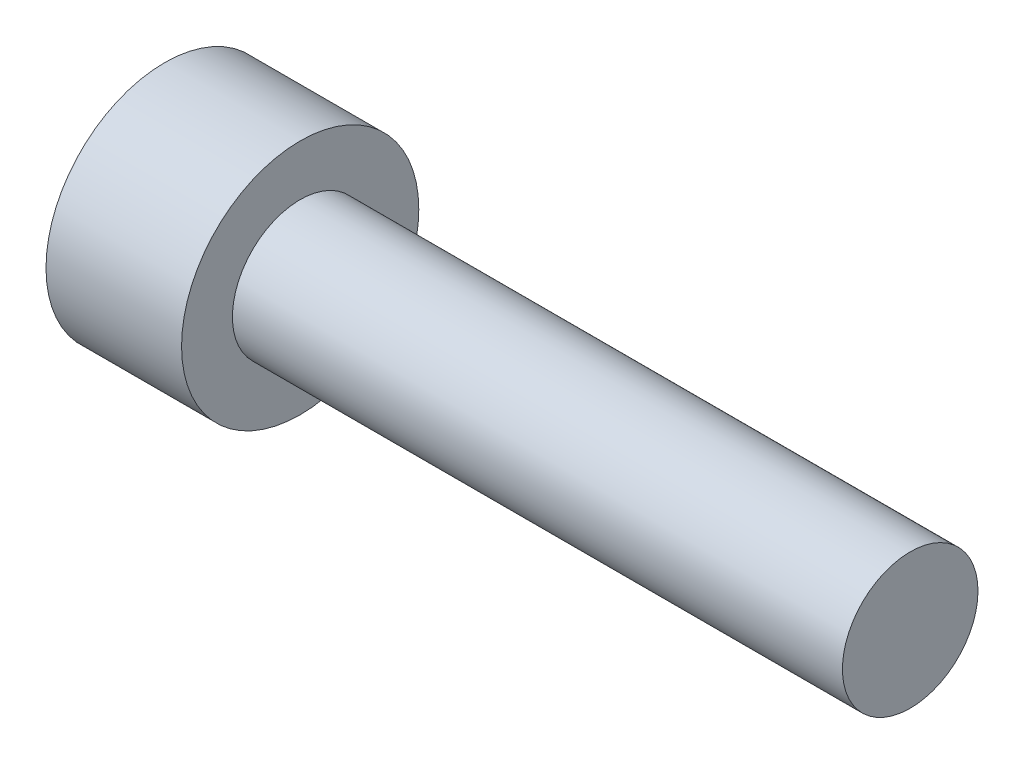
ISO-10303-21;
HEADER;
FILE_DESCRIPTION(('STEP AP214'),'2;1');
FILE_NAME('part.step','',(''),(''),'','','');
FILE_SCHEMA(('AUTOMOTIVE_DESIGN { 1 0 10303 214 1 1 1 1 }'));
ENDSEC;
DATA;
#1=APPLICATION_CONTEXT('core data for automotive mechanical design processes');
#2=APPLICATION_PROTOCOL_DEFINITION('international standard','automotive_design',2000,#1);
#3=PRODUCT_CONTEXT('',#1,'mechanical');
#4=PRODUCT('Part','Part','',(#3));
#5=PRODUCT_RELATED_PRODUCT_CATEGORY('part','',(#4));
#6=PRODUCT_DEFINITION_FORMATION('','',#4);
#7=PRODUCT_DEFINITION_CONTEXT('part definition',#1,'design');
#8=PRODUCT_DEFINITION('design','',#6,#7);
#9=PRODUCT_DEFINITION_SHAPE('','',#8);
#10=(LENGTH_UNIT() NAMED_UNIT(*) SI_UNIT(.MILLI.,.METRE.));
#11=(NAMED_UNIT(*) PLANE_ANGLE_UNIT() SI_UNIT($,.RADIAN.));
#12=(NAMED_UNIT(*) SI_UNIT($,.STERADIAN.) SOLID_ANGLE_UNIT());
#13=UNCERTAINTY_MEASURE_WITH_UNIT(LENGTH_MEASURE(1.E-05),#10,'distance_accuracy_value','');
#14=(GEOMETRIC_REPRESENTATION_CONTEXT(3) GLOBAL_UNCERTAINTY_ASSIGNED_CONTEXT((#13)) GLOBAL_UNIT_ASSIGNED_CONTEXT((#10,
#11,#12)) REPRESENTATION_CONTEXT('',''));
#15=CARTESIAN_POINT('',(0.,0.,0.));
#16=DIRECTION('',(0.,0.,1.));
#17=DIRECTION('',(1.,0.,0.));
#18=AXIS2_PLACEMENT_3D('',#15,#16,#17);
#19=CARTESIAN_POINT('',(4.,0.,0.));
#20=DIRECTION('',(-1.,0.,0.));
#21=DIRECTION('',(0.,0.,1.));
#22=AXIS2_PLACEMENT_3D('',#19,#20,#21);
#23=CYLINDRICAL_SURFACE('',#22,3.5);
#24=CARTESIAN_POINT('',(4.,0.,0.));
#25=DIRECTION('',(1.,0.,0.));
#26=DIRECTION('',(0.,0.,-1.));
#27=AXIS2_PLACEMENT_3D('',#24,#25,#26);
#28=CIRCLE('',#27,3.5);
#29=CARTESIAN_POINT('',(4.,0.,-3.5));
#30=VERTEX_POINT('',#29);
#31=EDGE_CURVE('E46',#30,#30,#28,.T.);
#32=ORIENTED_EDGE('',*,*,#31,.F.);
#33=EDGE_LOOP('',(#32));
#34=FACE_BOUND('',#33,.T.);
#35=CARTESIAN_POINT('',(0.,0.,0.));
#36=DIRECTION('',(1.,0.,0.));
#37=DIRECTION('',(0.,0.,-1.));
#38=AXIS2_PLACEMENT_3D('',#35,#36,#37);
#39=CIRCLE('',#38,3.5);
#40=CARTESIAN_POINT('',(0.,0.,-3.5));
#41=VERTEX_POINT('',#40);
#42=EDGE_CURVE('E41',#41,#41,#39,.T.);
#43=ORIENTED_EDGE('',*,*,#42,.T.);
#44=EDGE_LOOP('',(#43));
#45=FACE_BOUND('',#44,.T.);
#46=ADVANCED_FACE('F38',(#34,#45),#23,.T.);
#47=CARTESIAN_POINT('',(4.,0.,0.));
#48=DIRECTION('',(1.,0.,0.));
#49=DIRECTION('',(0.,0.,-1.));
#50=AXIS2_PLACEMENT_3D('',#47,#48,#49);
#51=PLANE('',#50);
#52=CARTESIAN_POINT('',(4.,0.,0.));
#53=DIRECTION('',(1.,0.,0.));
#54=DIRECTION('',(0.,0.,-1.));
#55=AXIS2_PLACEMENT_3D('',#52,#53,#54);
#56=CIRCLE('',#55,2.);
#57=CARTESIAN_POINT('',(4.,0.,-2.));
#58=VERTEX_POINT('',#57);
#59=EDGE_CURVE('E11',#58,#58,#56,.T.);
#60=ORIENTED_EDGE('',*,*,#59,.F.);
#61=EDGE_LOOP('',(#60));
#62=FACE_BOUND('',#61,.T.);
#63=ORIENTED_EDGE('',*,*,#31,.T.);
#64=EDGE_LOOP('',(#63));
#65=FACE_BOUND('',#64,.T.);
#66=ADVANCED_FACE('F156',(#62,#65),#51,.T.);
#67=CARTESIAN_POINT('',(0.,0.,0.));
#68=DIRECTION('',(1.,0.,0.));
#69=DIRECTION('',(0.,0.,-1.));
#70=AXIS2_PLACEMENT_3D('',#67,#68,#69);
#71=PLANE('',#70);
#72=DIRECTION('',(0.,1.,0.));
#73=VECTOR('',#72,1.);
#74=CARTESIAN_POINT('',(0.,-0.880459160514179,1.525));
#75=LINE('',#74,#73);
#76=CARTESIAN_POINT('',(0.,-0.880459160514179,1.525));
#77=VERTEX_POINT('',#76);
#78=CARTESIAN_POINT('',(0.,0.88045916051418,1.525));
#79=VERTEX_POINT('',#78);
#80=EDGE_CURVE('E128',#77,#79,#75,.T.);
#81=ORIENTED_EDGE('',*,*,#80,.F.);
#82=DIRECTION('',(0.,0.5,0.866025403784438));
#83=VECTOR('',#82,1.);
#84=CARTESIAN_POINT('',(0.,-1.76091832102836,0.));
#85=LINE('',#84,#83);
#86=CARTESIAN_POINT('',(0.,-1.76091832102836,0.));
#87=VERTEX_POINT('',#86);
#88=EDGE_CURVE('E54',#87,#77,#85,.T.);
#89=ORIENTED_EDGE('',*,*,#88,.F.);
#90=DIRECTION('',(0.,-0.5,0.866025403784439));
#91=VECTOR('',#90,1.);
#92=CARTESIAN_POINT('',(0.,-0.88045916051418,-1.525));
#93=LINE('',#92,#91);
#94=CARTESIAN_POINT('',(0.,-0.88045916051418,-1.525));
#95=VERTEX_POINT('',#94);
#96=EDGE_CURVE('E138',#95,#87,#93,.T.);
#97=ORIENTED_EDGE('',*,*,#96,.F.);
#98=DIRECTION('',(0.,-1.,0.));
#99=VECTOR('',#98,1.);
#100=CARTESIAN_POINT('',(0.,0.880459160514179,-1.525));
#101=LINE('',#100,#99);
#102=CARTESIAN_POINT('',(0.,0.880459160514179,-1.525));
#103=VERTEX_POINT('',#102);
#104=EDGE_CURVE('E136',#103,#95,#101,.T.);
#105=ORIENTED_EDGE('',*,*,#104,.F.);
#106=DIRECTION('',(0.,-0.5,-0.866025403784439));
#107=VECTOR('',#106,1.);
#108=CARTESIAN_POINT('',(0.,1.76091832102836,0.));
#109=LINE('',#108,#107);
#110=CARTESIAN_POINT('',(0.,1.76091832102836,0.));
#111=VERTEX_POINT('',#110);
#112=EDGE_CURVE('E102',#111,#103,#109,.T.);
#113=ORIENTED_EDGE('',*,*,#112,.F.);
#114=DIRECTION('',(0.,0.5,-0.866025403784439));
#115=VECTOR('',#114,1.);
#116=CARTESIAN_POINT('',(0.,0.88045916051418,1.525));
#117=LINE('',#116,#115);
#118=EDGE_CURVE('E132',#79,#111,#117,.T.);
#119=ORIENTED_EDGE('',*,*,#118,.F.);
#120=EDGE_LOOP('',(#81,#89,#97,#105,#113,#119));
#121=FACE_BOUND('',#120,.T.);
#122=ORIENTED_EDGE('',*,*,#42,.F.);
#123=EDGE_LOOP('',(#122));
#124=FACE_BOUND('',#123,.T.);
#125=ADVANCED_FACE('F153',(#121,#124),#71,.F.);
#126=CARTESIAN_POINT('',(2.,-1.76091832102836,0.));
#127=DIRECTION('',(0.,-0.866025403784439,0.5));
#128=DIRECTION('',(0.,-0.5,-0.866025403784438));
#129=AXIS2_PLACEMENT_3D('',#126,#127,#128);
#130=PLANE('',#129);
#131=ORIENTED_EDGE('',*,*,#88,.T.);
#132=DIRECTION('',(-1.,0.,0.));
#133=VECTOR('',#132,1.);
#134=CARTESIAN_POINT('',(2.,-0.880459160514179,1.525));
#135=LINE('',#134,#133);
#136=CARTESIAN_POINT('',(2.,-0.880459160514179,1.525));
#137=VERTEX_POINT('',#136);
#138=EDGE_CURVE('E84',#137,#77,#135,.T.);
#139=ORIENTED_EDGE('',*,*,#138,.F.);
#140=DIRECTION('',(0.,0.5,0.866025403784438));
#141=VECTOR('',#140,1.);
#142=CARTESIAN_POINT('',(2.,-1.76091832102836,0.));
#143=LINE('',#142,#141);
#144=CARTESIAN_POINT('',(2.,-1.76091832102836,0.));
#145=VERTEX_POINT('',#144);
#146=EDGE_CURVE('E140',#145,#137,#143,.T.);
#147=ORIENTED_EDGE('',*,*,#146,.F.);
#148=DIRECTION('',(-1.,0.,0.));
#149=VECTOR('',#148,1.);
#150=CARTESIAN_POINT('',(2.,-1.76091832102836,0.));
#151=LINE('',#150,#149);
#152=EDGE_CURVE('E62',#145,#87,#151,.T.);
#153=ORIENTED_EDGE('',*,*,#152,.T.);
#154=EDGE_LOOP('',(#131,#139,#147,#153));
#155=FACE_BOUND('',#154,.T.);
#156=ADVANCED_FACE('F155',(#155),#130,.F.);
#157=CARTESIAN_POINT('',(2.,-0.88045916051418,-1.525));
#158=DIRECTION('',(0.,-0.866025403784439,-0.5));
#159=DIRECTION('',(0.,0.5,-0.866025403784439));
#160=AXIS2_PLACEMENT_3D('',#157,#158,#159);
#161=PLANE('',#160);
#162=ORIENTED_EDGE('',*,*,#96,.T.);
#163=ORIENTED_EDGE('',*,*,#152,.F.);
#164=DIRECTION('',(0.,-0.5,0.866025403784439));
#165=VECTOR('',#164,1.);
#166=CARTESIAN_POINT('',(2.,-0.88045916051418,-1.525));
#167=LINE('',#166,#165);
#168=CARTESIAN_POINT('',(2.,-0.88045916051418,-1.525));
#169=VERTEX_POINT('',#168);
#170=EDGE_CURVE('E114',#169,#145,#167,.T.);
#171=ORIENTED_EDGE('',*,*,#170,.F.);
#172=DIRECTION('',(-1.,0.,0.));
#173=VECTOR('',#172,1.);
#174=CARTESIAN_POINT('',(2.,-0.88045916051418,-1.525));
#175=LINE('',#174,#173);
#176=EDGE_CURVE('E106',#169,#95,#175,.T.);
#177=ORIENTED_EDGE('',*,*,#176,.T.);
#178=EDGE_LOOP('',(#162,#163,#171,#177));
#179=FACE_BOUND('',#178,.T.);
#180=ADVANCED_FACE('F162',(#179),#161,.F.);
#181=CARTESIAN_POINT('',(2.,0.880459160514179,-1.525));
#182=DIRECTION('',(0.,0.,-1.));
#183=DIRECTION('',(0.,1.,0.));
#184=AXIS2_PLACEMENT_3D('',#181,#182,#183);
#185=PLANE('',#184);
#186=ORIENTED_EDGE('',*,*,#104,.T.);
#187=ORIENTED_EDGE('',*,*,#176,.F.);
#188=DIRECTION('',(0.,-1.,0.));
#189=VECTOR('',#188,1.);
#190=CARTESIAN_POINT('',(2.,0.880459160514179,-1.525));
#191=LINE('',#190,#189);
#192=CARTESIAN_POINT('',(2.,0.880459160514179,-1.525));
#193=VERTEX_POINT('',#192);
#194=EDGE_CURVE('E110',#193,#169,#191,.T.);
#195=ORIENTED_EDGE('',*,*,#194,.F.);
#196=DIRECTION('',(-1.,0.,0.));
#197=VECTOR('',#196,1.);
#198=CARTESIAN_POINT('',(2.,0.880459160514179,-1.525));
#199=LINE('',#198,#197);
#200=EDGE_CURVE('E95',#193,#103,#199,.T.);
#201=ORIENTED_EDGE('',*,*,#200,.T.);
#202=EDGE_LOOP('',(#186,#187,#195,#201));
#203=FACE_BOUND('',#202,.T.);
#204=ADVANCED_FACE('F111',(#203),#185,.F.);
#205=CARTESIAN_POINT('',(2.,1.76091832102836,0.));
#206=DIRECTION('',(0.,0.866025403784439,-0.5));
#207=DIRECTION('',(0.,0.5,0.866025403784439));
#208=AXIS2_PLACEMENT_3D('',#205,#206,#207);
#209=PLANE('',#208);
#210=ORIENTED_EDGE('',*,*,#112,.T.);
#211=ORIENTED_EDGE('',*,*,#200,.F.);
#212=DIRECTION('',(0.,-0.5,-0.866025403784439));
#213=VECTOR('',#212,1.);
#214=CARTESIAN_POINT('',(2.,1.76091832102836,0.));
#215=LINE('',#214,#213);
#216=CARTESIAN_POINT('',(2.,1.76091832102836,0.));
#217=VERTEX_POINT('',#216);
#218=EDGE_CURVE('E99',#217,#193,#215,.T.);
#219=ORIENTED_EDGE('',*,*,#218,.F.);
#220=DIRECTION('',(-1.,0.,0.));
#221=VECTOR('',#220,1.);
#222=CARTESIAN_POINT('',(2.,1.76091832102836,0.));
#223=LINE('',#222,#221);
#224=EDGE_CURVE('E107',#217,#111,#223,.T.);
#225=ORIENTED_EDGE('',*,*,#224,.T.);
#226=EDGE_LOOP('',(#210,#211,#219,#225));
#227=FACE_BOUND('',#226,.T.);
#228=ADVANCED_FACE('F97',(#227),#209,.F.);
#229=CARTESIAN_POINT('',(2.,0.88045916051418,1.525));
#230=DIRECTION('',(0.,0.866025403784439,0.5));
#231=DIRECTION('',(0.,-0.5,0.866025403784439));
#232=AXIS2_PLACEMENT_3D('',#229,#230,#231);
#233=PLANE('',#232);
#234=ORIENTED_EDGE('',*,*,#118,.T.);
#235=ORIENTED_EDGE('',*,*,#224,.F.);
#236=DIRECTION('',(0.,0.5,-0.866025403784439));
#237=VECTOR('',#236,1.);
#238=CARTESIAN_POINT('',(2.,0.88045916051418,1.525));
#239=LINE('',#238,#237);
#240=CARTESIAN_POINT('',(2.,0.88045916051418,1.525));
#241=VERTEX_POINT('',#240);
#242=EDGE_CURVE('E120',#241,#217,#239,.T.);
#243=ORIENTED_EDGE('',*,*,#242,.F.);
#244=DIRECTION('',(-1.,0.,0.));
#245=VECTOR('',#244,1.);
#246=CARTESIAN_POINT('',(2.,0.88045916051418,1.525));
#247=LINE('',#246,#245);
#248=EDGE_CURVE('E144',#241,#79,#247,.T.);
#249=ORIENTED_EDGE('',*,*,#248,.T.);
#250=EDGE_LOOP('',(#234,#235,#243,#249));
#251=FACE_BOUND('',#250,.T.);
#252=ADVANCED_FACE('F217',(#251),#233,.F.);
#253=CARTESIAN_POINT('',(2.,-0.880459160514179,1.525));
#254=DIRECTION('',(0.,0.,1.));
#255=DIRECTION('',(0.,-1.,0.));
#256=AXIS2_PLACEMENT_3D('',#253,#254,#255);
#257=PLANE('',#256);
#258=ORIENTED_EDGE('',*,*,#80,.T.);
#259=ORIENTED_EDGE('',*,*,#248,.F.);
#260=DIRECTION('',(0.,1.,0.));
#261=VECTOR('',#260,1.);
#262=CARTESIAN_POINT('',(2.,-0.880459160514179,1.525));
#263=LINE('',#262,#261);
#264=EDGE_CURVE('E122',#137,#241,#263,.T.);
#265=ORIENTED_EDGE('',*,*,#264,.F.);
#266=ORIENTED_EDGE('',*,*,#138,.T.);
#267=EDGE_LOOP('',(#258,#259,#265,#266));
#268=FACE_BOUND('',#267,.T.);
#269=ADVANCED_FACE('F213',(#268),#257,.F.);
#270=CARTESIAN_POINT('',(2.,0.,0.));
#271=DIRECTION('',(-1.,0.,0.));
#272=DIRECTION('',(0.,0.,1.));
#273=AXIS2_PLACEMENT_3D('',#270,#271,#272);
#274=PLANE('',#273);
#275=ORIENTED_EDGE('',*,*,#146,.T.);
#276=ORIENTED_EDGE('',*,*,#264,.T.);
#277=ORIENTED_EDGE('',*,*,#242,.T.);
#278=ORIENTED_EDGE('',*,*,#218,.T.);
#279=ORIENTED_EDGE('',*,*,#194,.T.);
#280=ORIENTED_EDGE('',*,*,#170,.T.);
#281=EDGE_LOOP('',(#275,#276,#277,#278,#279,#280));
#282=FACE_BOUND('',#281,.T.);
#283=ADVANCED_FACE('F117',(#282),#274,.T.);
#284=CARTESIAN_POINT('',(22.,0.,0.));
#285=DIRECTION('',(-1.,0.,0.));
#286=DIRECTION('',(0.,0.,1.));
#287=AXIS2_PLACEMENT_3D('',#284,#285,#286);
#288=CYLINDRICAL_SURFACE('',#287,2.);
#289=CARTESIAN_POINT('',(22.,0.,0.));
#290=DIRECTION('',(1.,0.,0.));
#291=DIRECTION('',(0.,0.,-1.));
#292=AXIS2_PLACEMENT_3D('',#289,#290,#291);
#293=CIRCLE('',#292,2.);
#294=CARTESIAN_POINT('',(22.,0.,-2.));
#295=VERTEX_POINT('',#294);
#296=EDGE_CURVE('E129',#295,#295,#293,.T.);
#297=ORIENTED_EDGE('',*,*,#296,.F.);
#298=EDGE_LOOP('',(#297));
#299=FACE_BOUND('',#298,.T.);
#300=ORIENTED_EDGE('',*,*,#59,.T.);
#301=EDGE_LOOP('',(#300));
#302=FACE_BOUND('',#301,.T.);
#303=ADVANCED_FACE('F186',(#299,#302),#288,.T.);
#304=CARTESIAN_POINT('',(22.,0.,0.));
#305=DIRECTION('',(1.,0.,0.));
#306=DIRECTION('',(0.,0.,-1.));
#307=AXIS2_PLACEMENT_3D('',#304,#305,#306);
#308=PLANE('',#307);
#309=ORIENTED_EDGE('',*,*,#296,.T.);
#310=EDGE_LOOP('',(#309));
#311=FACE_BOUND('',#310,.T.);
#312=ADVANCED_FACE('F192',(#311),#308,.T.);
#313=CLOSED_SHELL('',(#46,#66,#125,#156,#180,#204,#228,#252,#269,#283,#303,#312));
#314=MANIFOLD_SOLID_BREP('B2',#313);
#315=ADVANCED_BREP_SHAPE_REPRESENTATION('',(#18,#314),#14);
#316=SHAPE_DEFINITION_REPRESENTATION(#9,#315);
ENDSEC;
END-ISO-10303-21;
